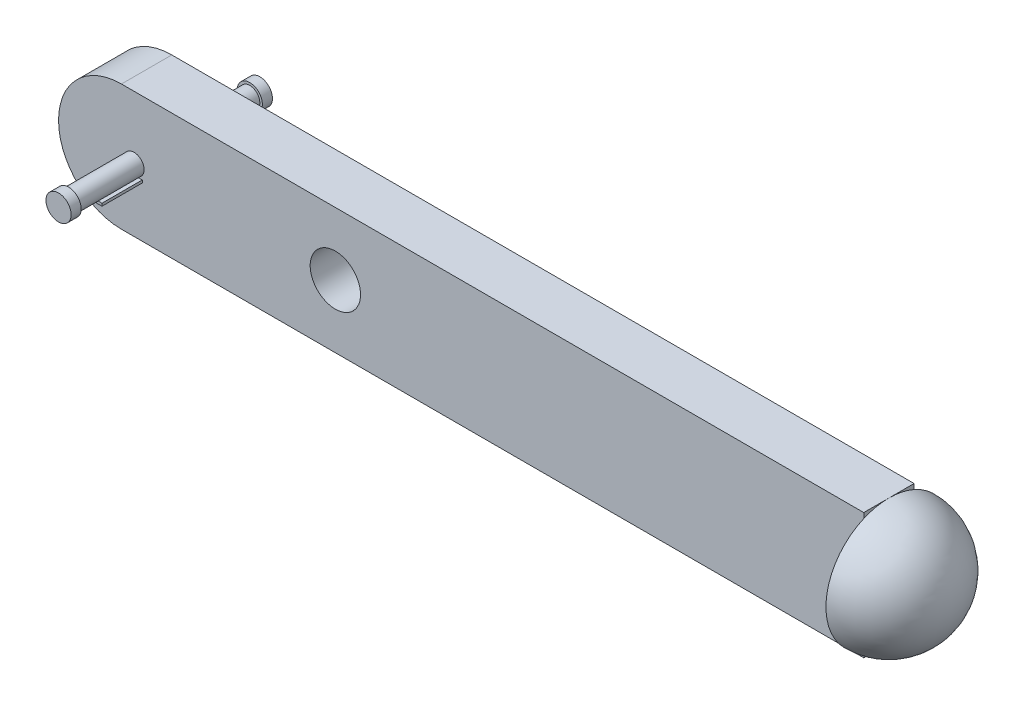
ISO-10303-21;
HEADER;
FILE_DESCRIPTION(('STEP AP214'),'2;1');
FILE_NAME('part.step','',(''),(''),'','','');
FILE_SCHEMA(('AUTOMOTIVE_DESIGN { 1 0 10303 214 1 1 1 1 }'));
ENDSEC;
DATA;
#1=APPLICATION_CONTEXT('core data for automotive mechanical design processes');
#2=APPLICATION_PROTOCOL_DEFINITION('international standard','automotive_design',2000,#1);
#3=PRODUCT_CONTEXT('',#1,'mechanical');
#4=PRODUCT('Part','Part','',(#3));
#5=PRODUCT_RELATED_PRODUCT_CATEGORY('part','',(#4));
#6=PRODUCT_DEFINITION_FORMATION('','',#4);
#7=PRODUCT_DEFINITION_CONTEXT('part definition',#1,'design');
#8=PRODUCT_DEFINITION('design','',#6,#7);
#9=PRODUCT_DEFINITION_SHAPE('','',#8);
#10=(LENGTH_UNIT() NAMED_UNIT(*) SI_UNIT(.MILLI.,.METRE.));
#11=(NAMED_UNIT(*) PLANE_ANGLE_UNIT() SI_UNIT($,.RADIAN.));
#12=(NAMED_UNIT(*) SI_UNIT($,.STERADIAN.) SOLID_ANGLE_UNIT());
#13=UNCERTAINTY_MEASURE_WITH_UNIT(LENGTH_MEASURE(1.E-05),#10,'distance_accuracy_value','');
#14=(GEOMETRIC_REPRESENTATION_CONTEXT(3) GLOBAL_UNCERTAINTY_ASSIGNED_CONTEXT((#13)) GLOBAL_UNIT_ASSIGNED_CONTEXT((#10,
#11,#12)) REPRESENTATION_CONTEXT('',''));
#15=CARTESIAN_POINT('',(0.,0.,0.));
#16=DIRECTION('',(0.,0.,1.));
#17=DIRECTION('',(1.,0.,0.));
#18=AXIS2_PLACEMENT_3D('',#15,#16,#17);
#19=CARTESIAN_POINT('',(-170.812032832531,-25.8599299364117,12.7));
#20=DIRECTION('',(0.,0.,1.));
#21=DIRECTION('',(1.,0.,0.));
#22=AXIS2_PLACEMENT_3D('',#19,#20,#21);
#23=PLANE('',#22);
#24=CARTESIAN_POINT('',(-170.812032832531,-25.8599299364117,12.7));
#25=DIRECTION('',(0.,0.,1.));
#26=DIRECTION('',(1.,0.,0.));
#27=AXIS2_PLACEMENT_3D('',#24,#25,#26);
#28=CIRCLE('',#27,15.875);
#29=CARTESIAN_POINT('',(-170.812032832531,-9.9849299364117,12.7));
#30=VERTEX_POINT('',#29);
#31=CARTESIAN_POINT('',(-170.812032832531,-41.7349299364117,12.7));
#32=VERTEX_POINT('',#31);
#33=EDGE_CURVE('E276',#30,#32,#28,.T.);
#34=ORIENTED_EDGE('',*,*,#33,.T.);
#35=DIRECTION('',(1.,0.,0.));
#36=VECTOR('',#35,1.);
#37=CARTESIAN_POINT('',(-170.812032832531,-41.7349299364117,12.7));
#38=LINE('',#37,#36);
#39=CARTESIAN_POINT('',(16.5129671674695,-41.7349299364117,12.7));
#40=VERTEX_POINT('',#39);
#41=EDGE_CURVE('E279',#32,#40,#38,.T.);
#42=ORIENTED_EDGE('',*,*,#41,.T.);
#43=DIRECTION('',(0.,1.,0.));
#44=VECTOR('',#43,1.);
#45=CARTESIAN_POINT('',(16.5129671674695,-9.9849299364117,12.7));
#46=LINE('',#45,#44);
#47=CARTESIAN_POINT('',(16.5129671674694,-40.4185580614862,12.7));
#48=VERTEX_POINT('',#47);
#49=EDGE_CURVE('E283',#40,#48,#46,.T.);
#50=ORIENTED_EDGE('',*,*,#49,.T.);
#51=DIRECTION('',(0.,-1.,0.));
#52=VECTOR('',#51,1.);
#53=CARTESIAN_POINT('',(16.5129671674695,-25.8599299364121,12.7));
#54=LINE('',#53,#52);
#55=CARTESIAN_POINT('',(16.5129671674694,-11.3013018113372,12.7));
#56=VERTEX_POINT('',#55);
#57=EDGE_CURVE('E252',#56,#48,#54,.T.);
#58=ORIENTED_EDGE('',*,*,#57,.F.);
#59=CARTESIAN_POINT('',(16.5129671674695,-9.9849299364117,12.7));
#60=VERTEX_POINT('',#59);
#61=EDGE_CURVE('E282',#56,#60,#46,.T.);
#62=ORIENTED_EDGE('',*,*,#61,.T.);
#63=DIRECTION('',(-1.,0.,0.));
#64=VECTOR('',#63,1.);
#65=CARTESIAN_POINT('',(-170.812032832531,-9.9849299364117,12.7));
#66=LINE('',#65,#64);
#67=EDGE_CURVE('E286',#60,#30,#66,.T.);
#68=ORIENTED_EDGE('',*,*,#67,.T.);
#69=EDGE_LOOP('',(#34,#42,#50,#58,#62,#68));
#70=FACE_BOUND('',#69,.T.);
#71=CARTESIAN_POINT('',(-116.837032832531,-25.8599299364116,12.7));
#72=DIRECTION('',(0.,0.,1.));
#73=DIRECTION('',(1.,0.,0.));
#74=AXIS2_PLACEMENT_3D('',#71,#72,#73);
#75=CIRCLE('',#74,6.35);
#76=CARTESIAN_POINT('',(-110.487032832531,-25.8599299364116,12.7));
#77=VERTEX_POINT('',#76);
#78=EDGE_CURVE('E270',#77,#77,#75,.T.);
#79=ORIENTED_EDGE('',*,*,#78,.F.);
#80=EDGE_LOOP('',(#79));
#81=FACE_BOUND('',#80,.T.);
#82=DIRECTION('',(0.,-1.,0.));
#83=VECTOR('',#82,1.);
#84=CARTESIAN_POINT('',(-169.626679104184,-28.33418390755,12.7));
#85=LINE('',#84,#83);
#86=CARTESIAN_POINT('',(-169.626679104184,-28.33418390755,12.7));
#87=VERTEX_POINT('',#86);
#88=CARTESIAN_POINT('',(-169.626679104184,-28.9947135871267,12.7));
#89=VERTEX_POINT('',#88);
#90=EDGE_CURVE('E71',#87,#89,#85,.T.);
#91=ORIENTED_EDGE('',*,*,#90,.F.);
#92=DIRECTION('',(-1.,0.,0.));
#93=VECTOR('',#92,1.);
#94=CARTESIAN_POINT('',(-169.626679104184,-28.33418390755,12.7));
#95=LINE('',#94,#93);
#96=CARTESIAN_POINT('',(-168.211199434055,-28.33418390755,12.7));
#97=VERTEX_POINT('',#96);
#98=EDGE_CURVE('E370',#97,#87,#95,.T.);
#99=ORIENTED_EDGE('',*,*,#98,.F.);
#100=CARTESIAN_POINT('',(-167.637032832531,-25.8599299364117,12.7));
#101=DIRECTION('',(0.,0.,1.));
#102=DIRECTION('',(1.,0.,0.));
#103=AXIS2_PLACEMENT_3D('',#100,#101,#102);
#104=CIRCLE('',#103,2.53999999999998);
#105=CARTESIAN_POINT('',(-167.062866231006,-28.33418390755,12.7));
#106=VERTEX_POINT('',#105);
#107=EDGE_CURVE('E259',#97,#106,#104,.F.);
#108=ORIENTED_EDGE('',*,*,#107,.T.);
#109=CARTESIAN_POINT('',(-165.564847217515,-28.33418390755,12.7));
#110=VERTEX_POINT('',#109);
#111=EDGE_CURVE('E181',#110,#106,#95,.T.);
#112=ORIENTED_EDGE('',*,*,#111,.F.);
#113=DIRECTION('',(0.,1.,0.));
#114=VECTOR('',#113,1.);
#115=CARTESIAN_POINT('',(-165.564847217515,-28.33418390755,12.7));
#116=LINE('',#115,#114);
#117=CARTESIAN_POINT('',(-165.564847217515,-28.9947135871267,12.7));
#118=VERTEX_POINT('',#117);
#119=EDGE_CURVE('E367',#118,#110,#116,.T.);
#120=ORIENTED_EDGE('',*,*,#119,.F.);
#121=DIRECTION('',(1.,0.,0.));
#122=VECTOR('',#121,1.);
#123=CARTESIAN_POINT('',(-169.626679104184,-28.9947135871267,12.7));
#124=LINE('',#123,#122);
#125=EDGE_CURVE('E76',#89,#118,#124,.T.);
#126=ORIENTED_EDGE('',*,*,#125,.F.);
#127=EDGE_LOOP('',(#91,#99,#108,#112,#120,#126));
#128=FACE_BOUND('',#127,.T.);
#129=ADVANCED_FACE('F56',(#70,#81,#128),#23,.T.);
#130=CARTESIAN_POINT('',(-167.637032832531,-25.8599299364117,-195.02216631898));
#131=DIRECTION('',(0.,0.,1.));
#132=DIRECTION('',(1.,0.,0.));
#133=AXIS2_PLACEMENT_3D('',#130,#131,#132);
#134=CYLINDRICAL_SURFACE('',#133,2.53999999999998);
#135=CARTESIAN_POINT('',(-167.637032832531,-25.8599299364117,29.21));
#136=DIRECTION('',(0.,0.,1.));
#137=DIRECTION('',(1.,0.,0.));
#138=AXIS2_PLACEMENT_3D('',#135,#136,#137);
#139=CIRCLE('',#138,2.53999999999998);
#140=CARTESIAN_POINT('',(-165.097032832531,-25.8599299364117,29.21));
#141=VERTEX_POINT('',#140);
#142=EDGE_CURVE('E256',#141,#141,#139,.T.);
#143=ORIENTED_EDGE('',*,*,#142,.F.);
#144=EDGE_LOOP('',(#143));
#145=FACE_BOUND('',#144,.T.);
#146=CARTESIAN_POINT('',(-167.637032832531,-25.8599299364117,22.86));
#147=DIRECTION('',(0.,0.,1.));
#148=DIRECTION('',(1.,0.,0.));
#149=AXIS2_PLACEMENT_3D('',#146,#147,#148);
#150=CIRCLE('',#149,2.53999999999998);
#151=CARTESIAN_POINT('',(-167.062866231006,-28.33418390755,22.86));
#152=VERTEX_POINT('',#151);
#153=CARTESIAN_POINT('',(-168.211199434055,-28.33418390755,22.86));
#154=VERTEX_POINT('',#153);
#155=EDGE_CURVE('E350',#152,#154,#150,.F.);
#156=ORIENTED_EDGE('',*,*,#155,.F.);
#157=DIRECTION('',(0.,0.,1.));
#158=VECTOR('',#157,1.);
#159=CARTESIAN_POINT('',(-167.062866231006,-28.33418390755,-195.02216631898));
#160=LINE('',#159,#158);
#161=EDGE_CURVE('E13',#152,#106,#160,.F.);
#162=ORIENTED_EDGE('',*,*,#161,.T.);
#163=ORIENTED_EDGE('',*,*,#107,.F.);
#164=DIRECTION('',(0.,0.,1.));
#165=VECTOR('',#164,1.);
#166=CARTESIAN_POINT('',(-168.211199434055,-28.33418390755,-195.02216631898));
#167=LINE('',#166,#165);
#168=EDGE_CURVE('E64',#97,#154,#167,.T.);
#169=ORIENTED_EDGE('',*,*,#168,.T.);
#170=EDGE_LOOP('',(#156,#162,#163,#169));
#171=FACE_BOUND('',#170,.T.);
#172=ADVANCED_FACE('F355',(#145,#171),#134,.T.);
#173=CARTESIAN_POINT('',(16.5129671674695,-9.9849299364117,12.7));
#174=DIRECTION('',(-1.,0.,0.));
#175=DIRECTION('',(0.,0.,1.));
#176=AXIS2_PLACEMENT_3D('',#173,#174,#175);
#177=PLANE('',#176);
#178=CARTESIAN_POINT('',(16.5129671674694,-25.8599299364117,6.32948599336883));
#179=DIRECTION('',(-1.,0.,0.));
#180=DIRECTION('',(0.,1.,0.));
#181=AXIS2_PLACEMENT_3D('',#178,#179,#180);
#182=CIRCLE('',#181,15.8750132543082);
#183=CARTESIAN_POINT('',(16.5129671674693,-40.4185580614862,0.));
#184=VERTEX_POINT('',#183);
#185=CARTESIAN_POINT('',(16.5129671674694,-41.7349299364117,6.30897198690457));
#186=VERTEX_POINT('',#185);
#187=EDGE_CURVE('E216',#184,#186,#182,.T.);
#188=ORIENTED_EDGE('',*,*,#187,.T.);
#189=DIRECTION('',(0.,0.,-1.));
#190=VECTOR('',#189,1.);
#191=CARTESIAN_POINT('',(16.5129671674695,-41.7349299364117,12.7));
#192=LINE('',#191,#190);
#193=CARTESIAN_POINT('',(16.5129671674695,-41.7349299364117,0.));
#194=VERTEX_POINT('',#193);
#195=EDGE_CURVE('E315',#186,#194,#192,.T.);
#196=ORIENTED_EDGE('',*,*,#195,.T.);
#197=DIRECTION('',(0.,1.,0.));
#198=VECTOR('',#197,1.);
#199=CARTESIAN_POINT('',(16.5129671674695,-9.9849299364117,0.));
#200=LINE('',#199,#198);
#201=EDGE_CURVE('E295',#194,#184,#200,.T.);
#202=ORIENTED_EDGE('',*,*,#201,.T.);
#203=EDGE_LOOP('',(#188,#196,#202));
#204=FACE_BOUND('',#203,.T.);
#205=ADVANCED_FACE('F385',(#204),#177,.F.);
#206=CARTESIAN_POINT('',(16.5129671674695,-9.9849299364117,6.30897198690457));
#207=VERTEX_POINT('',#206);
#208=CARTESIAN_POINT('',(16.5129671674693,-11.3013018113372,0.));
#209=VERTEX_POINT('',#208);
#210=EDGE_CURVE('E439',#207,#209,#182,.T.);
#211=ORIENTED_EDGE('',*,*,#210,.T.);
#212=CARTESIAN_POINT('',(16.5129671674695,-9.9849299364117,0.));
#213=VERTEX_POINT('',#212);
#214=EDGE_CURVE('E294',#209,#213,#200,.T.);
#215=ORIENTED_EDGE('',*,*,#214,.T.);
#216=DIRECTION('',(0.,0.,-1.));
#217=VECTOR('',#216,1.);
#218=CARTESIAN_POINT('',(16.5129671674695,-9.9849299364117,12.7));
#219=LINE('',#218,#217);
#220=EDGE_CURVE('E301',#207,#213,#219,.T.);
#221=ORIENTED_EDGE('',*,*,#220,.F.);
#222=EDGE_LOOP('',(#211,#215,#221));
#223=FACE_BOUND('',#222,.T.);
#224=ADVANCED_FACE('F453',(#223),#177,.F.);
#225=CARTESIAN_POINT('',(16.5129671674694,-25.8599299364117,6.37051400663117));
#226=DIRECTION('',(1.,0.,0.));
#227=DIRECTION('',(0.,1.,0.));
#228=AXIS2_PLACEMENT_3D('',#225,#226,#227);
#229=CIRCLE('',#228,15.8750132543082);
#230=CARTESIAN_POINT('',(16.5129671674695,-9.9849299364117,6.39102801309543));
#231=VERTEX_POINT('',#230);
#232=EDGE_CURVE('E195',#231,#56,#229,.T.);
#233=ORIENTED_EDGE('',*,*,#232,.F.);
#234=EDGE_CURVE('E311',#60,#231,#219,.T.);
#235=ORIENTED_EDGE('',*,*,#234,.F.);
#236=ORIENTED_EDGE('',*,*,#61,.F.);
#237=EDGE_LOOP('',(#233,#235,#236));
#238=FACE_BOUND('',#237,.T.);
#239=ADVANCED_FACE('F395',(#238),#177,.F.);
#240=CARTESIAN_POINT('',(-170.812032832531,-25.8599299364117,0.));
#241=DIRECTION('',(0.,0.,1.));
#242=DIRECTION('',(1.,0.,0.));
#243=AXIS2_PLACEMENT_3D('',#240,#241,#242);
#244=PLANE('',#243);
#245=CARTESIAN_POINT('',(-170.812032832531,-25.8599299364117,0.));
#246=DIRECTION('',(0.,0.,1.));
#247=DIRECTION('',(1.,0.,0.));
#248=AXIS2_PLACEMENT_3D('',#245,#246,#247);
#249=CIRCLE('',#248,15.875);
#250=CARTESIAN_POINT('',(-170.812032832531,-9.9849299364117,0.));
#251=VERTEX_POINT('',#250);
#252=CARTESIAN_POINT('',(-170.812032832531,-41.7349299364117,0.));
#253=VERTEX_POINT('',#252);
#254=EDGE_CURVE('E273',#251,#253,#249,.T.);
#255=ORIENTED_EDGE('',*,*,#254,.F.);
#256=DIRECTION('',(-1.,0.,0.));
#257=VECTOR('',#256,1.);
#258=CARTESIAN_POINT('',(-170.812032832531,-9.9849299364117,0.));
#259=LINE('',#258,#257);
#260=EDGE_CURVE('E280',#213,#251,#259,.T.);
#261=ORIENTED_EDGE('',*,*,#260,.F.);
#262=ORIENTED_EDGE('',*,*,#214,.F.);
#263=DIRECTION('',(0.,-1.,0.));
#264=VECTOR('',#263,1.);
#265=CARTESIAN_POINT('',(16.5129671674693,-25.8599299364121,0.));
#266=LINE('',#265,#264);
#267=EDGE_CURVE('E447',#209,#184,#266,.T.);
#268=ORIENTED_EDGE('',*,*,#267,.T.);
#269=ORIENTED_EDGE('',*,*,#201,.F.);
#270=DIRECTION('',(1.,0.,0.));
#271=VECTOR('',#270,1.);
#272=CARTESIAN_POINT('',(-170.812032832531,-41.7349299364117,0.));
#273=LINE('',#272,#271);
#274=EDGE_CURVE('E291',#253,#194,#273,.T.);
#275=ORIENTED_EDGE('',*,*,#274,.F.);
#276=EDGE_LOOP('',(#255,#261,#262,#268,#269,#275));
#277=FACE_BOUND('',#276,.T.);
#278=CARTESIAN_POINT('',(-116.837032832531,-25.8599299364116,0.));
#279=DIRECTION('',(0.,0.,1.));
#280=DIRECTION('',(1.,0.,0.));
#281=AXIS2_PLACEMENT_3D('',#278,#279,#280);
#282=CIRCLE('',#281,6.35);
#283=CARTESIAN_POINT('',(-110.487032832531,-25.8599299364116,0.));
#284=VERTEX_POINT('',#283);
#285=EDGE_CURVE('E269',#284,#284,#282,.T.);
#286=ORIENTED_EDGE('',*,*,#285,.T.);
#287=EDGE_LOOP('',(#286));
#288=FACE_BOUND('',#287,.T.);
#289=CARTESIAN_POINT('',(-167.637032832531,-25.8599299364117,0.));
#290=DIRECTION('',(0.,0.,1.));
#291=DIRECTION('',(1.,0.,0.));
#292=AXIS2_PLACEMENT_3D('',#289,#290,#291);
#293=CIRCLE('',#292,2.53999999999998);
#294=CARTESIAN_POINT('',(-165.097032832531,-25.8599299364117,0.));
#295=VERTEX_POINT('',#294);
#296=EDGE_CURVE('E251',#295,#295,#293,.F.);
#297=ORIENTED_EDGE('',*,*,#296,.F.);
#298=EDGE_LOOP('',(#297));
#299=FACE_BOUND('',#298,.T.);
#300=ADVANCED_FACE('F393',(#277,#288,#299),#244,.F.);
#301=CARTESIAN_POINT('',(-170.812032832531,-25.8599299364117,12.7));
#302=DIRECTION('',(0.,0.,-1.));
#303=DIRECTION('',(-1.,0.,0.));
#304=AXIS2_PLACEMENT_3D('',#301,#302,#303);
#305=CYLINDRICAL_SURFACE('',#304,15.875);
#306=ORIENTED_EDGE('',*,*,#254,.T.);
#307=DIRECTION('',(0.,0.,-1.));
#308=VECTOR('',#307,1.);
#309=CARTESIAN_POINT('',(-170.812032832531,-41.7349299364117,12.7));
#310=LINE('',#309,#308);
#311=EDGE_CURVE('E351',#32,#253,#310,.T.);
#312=ORIENTED_EDGE('',*,*,#311,.F.);
#313=ORIENTED_EDGE('',*,*,#33,.F.);
#314=DIRECTION('',(0.,0.,-1.));
#315=VECTOR('',#314,1.);
#316=CARTESIAN_POINT('',(-170.812032832531,-9.9849299364117,12.7));
#317=LINE('',#316,#315);
#318=EDGE_CURVE('E288',#30,#251,#317,.T.);
#319=ORIENTED_EDGE('',*,*,#318,.T.);
#320=EDGE_LOOP('',(#306,#312,#313,#319));
#321=FACE_BOUND('',#320,.T.);
#322=ADVANCED_FACE('F58',(#321),#305,.T.);
#323=CARTESIAN_POINT('',(-170.812032832531,-41.7349299364117,12.7));
#324=DIRECTION('',(0.,1.,0.));
#325=DIRECTION('',(0.,0.,1.));
#326=AXIS2_PLACEMENT_3D('',#323,#324,#325);
#327=PLANE('',#326);
#328=ORIENTED_EDGE('',*,*,#274,.T.);
#329=ORIENTED_EDGE('',*,*,#195,.F.);
#330=CARTESIAN_POINT('',(16.5129671674695,-41.7349299364117,6.30897198690457));
#331=DIRECTION('',(0.,0.,1.));
#332=VECTOR('',#331,1.);
#333=LINE('',#330,#332);
#334=CARTESIAN_POINT('',(16.5129671674694,-41.7349299364113,6.35));
#335=VERTEX_POINT('',#334);
#336=EDGE_CURVE('E434',#186,#335,#333,.T.);
#337=ORIENTED_EDGE('',*,*,#336,.T.);
#338=CARTESIAN_POINT('',(16.5129671674694,-41.7349299364117,6.39102801309543));
#339=CARTESIAN_POINT('',(16.5129671674694,-41.7349321454628,6.38931851350131));
#340=CARTESIAN_POINT('',(16.5129671674694,-41.7349340783826,6.38760901355037));
#341=CARTESIAN_POINT('',(16.5129671674694,-41.7349373919596,6.38419001311326));
#342=CARTESIAN_POINT('',(16.5129671674694,-41.7349387726168,6.38248051262709));
#343=CARTESIAN_POINT('',(16.5129671674694,-41.7349409816683,6.37906151129792));
#344=CARTESIAN_POINT('',(16.5129671674694,-41.7349418100627,6.37735201045493));
#345=CARTESIAN_POINT('',(16.5129671674694,-41.7349429145885,6.37393300859053));
#346=CARTESIAN_POINT('',(16.5129671674694,-41.7349431907199,6.37222350756912));
#347=CARTESIAN_POINT('',(16.5129671674694,-41.7349431907199,6.36880450552631));
#348=CARTESIAN_POINT('',(16.5129671674694,-41.7349429145884,6.3670950045049));
#349=CARTESIAN_POINT('',(16.5129671674694,-41.7349418100626,6.3636760026405));
#350=CARTESIAN_POINT('',(16.5129671674694,-41.7349409816682,6.3619665017975));
#351=CARTESIAN_POINT('',(16.5129671674694,-41.7349387726167,6.35854750046834));
#352=CARTESIAN_POINT('',(16.5129671674694,-41.7349373919595,6.35683799998217));
#353=CARTESIAN_POINT('',(16.5129671674694,-41.7349340783824,6.35341899954506));
#354=CARTESIAN_POINT('',(16.5129671674694,-41.7349321454626,6.35170949959412));
#355=CARTESIAN_POINT('',(16.5129671674694,-41.7349299364115,6.35));
#356=B_SPLINE_CURVE_WITH_KNOTS('',3,(#338,#339,#340,#341,#342,#343,#344,#345,#346,#347,#348,
#349,#350,#351,#352,#353,#354,#355),.UNSPECIFIED.,.F.,.F.,(4,2,2,2,2,2,2,2,4),(0.,
0.00512850304191755,0.0102570060838343,0.0153855091257516,0.0205140121676691,0.0256425152095866,
0.0307710182515039,0.0358995212934216,0.0410280243353383),.UNSPECIFIED.);
#357=CARTESIAN_POINT('',(16.5129671674694,-41.7349299364117,6.39102801309543));
#358=VERTEX_POINT('',#357);
#359=EDGE_CURVE('E211',#358,#335,#356,.T.);
#360=ORIENTED_EDGE('',*,*,#359,.F.);
#361=EDGE_CURVE('E327',#40,#358,#192,.T.);
#362=ORIENTED_EDGE('',*,*,#361,.F.);
#363=ORIENTED_EDGE('',*,*,#41,.F.);
#364=ORIENTED_EDGE('',*,*,#311,.T.);
#365=EDGE_LOOP('',(#328,#329,#337,#360,#362,#363,#364));
#366=FACE_BOUND('',#365,.T.);
#367=ADVANCED_FACE('F329',(#366),#327,.F.);
#368=EDGE_CURVE('E184',#48,#358,#229,.T.);
#369=ORIENTED_EDGE('',*,*,#368,.F.);
#370=ORIENTED_EDGE('',*,*,#49,.F.);
#371=ORIENTED_EDGE('',*,*,#361,.T.);
#372=EDGE_LOOP('',(#369,#370,#371));
#373=FACE_BOUND('',#372,.T.);
#374=ADVANCED_FACE('F338',(#373),#177,.F.);
#375=CARTESIAN_POINT('',(-170.812032832531,-9.9849299364117,12.7));
#376=DIRECTION('',(0.,-1.,0.));
#377=DIRECTION('',(0.,0.,-1.));
#378=AXIS2_PLACEMENT_3D('',#375,#376,#377);
#379=PLANE('',#378);
#380=ORIENTED_EDGE('',*,*,#260,.T.);
#381=ORIENTED_EDGE('',*,*,#318,.F.);
#382=ORIENTED_EDGE('',*,*,#67,.F.);
#383=ORIENTED_EDGE('',*,*,#234,.T.);
#384=CARTESIAN_POINT('',(16.5129671674695,-9.9849299364117,6.39102801309543));
#385=DIRECTION('',(0.,0.,-1.));
#386=VECTOR('',#385,1.);
#387=LINE('',#384,#386);
#388=CARTESIAN_POINT('',(16.5129671674694,-9.9849299364117,6.35));
#389=VERTEX_POINT('',#388);
#390=EDGE_CURVE('E316',#231,#389,#387,.T.);
#391=ORIENTED_EDGE('',*,*,#390,.T.);
#392=CARTESIAN_POINT('',(16.5129671674695,-9.9849299364117,6.35000000016691));
#393=DIRECTION('',(0.,0.,-1.));
#394=VECTOR('',#393,1.);
#395=LINE('',#392,#394);
#396=EDGE_CURVE('E414',#389,#207,#395,.T.);
#397=ORIENTED_EDGE('',*,*,#396,.T.);
#398=ORIENTED_EDGE('',*,*,#220,.T.);
#399=EDGE_LOOP('',(#380,#381,#382,#383,#391,#397,#398));
#400=FACE_BOUND('',#399,.T.);
#401=ADVANCED_FACE('F397',(#400),#379,.F.);
#402=CARTESIAN_POINT('',(-116.837032832531,-25.8599299364116,12.7));
#403=DIRECTION('',(0.,0.,-1.));
#404=DIRECTION('',(-1.,0.,0.));
#405=AXIS2_PLACEMENT_3D('',#402,#403,#404);
#406=CYLINDRICAL_SURFACE('',#405,6.35);
#407=ORIENTED_EDGE('',*,*,#78,.T.);
#408=EDGE_LOOP('',(#407));
#409=FACE_BOUND('',#408,.T.);
#410=ORIENTED_EDGE('',*,*,#285,.F.);
#411=EDGE_LOOP('',(#410));
#412=FACE_BOUND('',#411,.T.);
#413=ADVANCED_FACE('F391',(#409,#412),#406,.F.);
#414=CARTESIAN_POINT('',(-85.0870328325305,-25.8599299364117,29.21));
#415=DIRECTION('',(0.,0.,1.));
#416=DIRECTION('',(1.,0.,0.));
#417=AXIS2_PLACEMENT_3D('',#414,#415,#416);
#418=PLANE('',#417);
#419=CARTESIAN_POINT('',(-167.637032832531,-25.8599299364117,29.21));
#420=DIRECTION('',(0.,0.,1.));
#421=DIRECTION('',(1.,0.,0.));
#422=AXIS2_PLACEMENT_3D('',#419,#420,#421);
#423=CIRCLE('',#422,3.175);
#424=CARTESIAN_POINT('',(-164.46203283253,-25.8599299364117,29.21));
#425=VERTEX_POINT('',#424);
#426=EDGE_CURVE('E262',#425,#425,#423,.F.);
#427=ORIENTED_EDGE('',*,*,#426,.T.);
#428=EDGE_LOOP('',(#427));
#429=FACE_BOUND('',#428,.T.);
#430=ORIENTED_EDGE('',*,*,#142,.T.);
#431=EDGE_LOOP('',(#430));
#432=FACE_BOUND('',#431,.T.);
#433=ADVANCED_FACE('F612',(#429,#432),#418,.F.);
#434=CARTESIAN_POINT('',(-167.637032832531,-25.8599299364117,31.75));
#435=DIRECTION('',(0.,0.,1.));
#436=DIRECTION('',(1.,0.,0.));
#437=AXIS2_PLACEMENT_3D('',#434,#435,#436);
#438=PLANE('',#437);
#439=CARTESIAN_POINT('',(-167.637032832531,-25.8599299364117,31.75));
#440=DIRECTION('',(0.,0.,1.));
#441=DIRECTION('',(1.,0.,0.));
#442=AXIS2_PLACEMENT_3D('',#439,#440,#441);
#443=CIRCLE('',#442,3.175);
#444=CARTESIAN_POINT('',(-164.46203283253,-25.8599299364117,31.75));
#445=VERTEX_POINT('',#444);
#446=EDGE_CURVE('E263',#445,#445,#443,.T.);
#447=ORIENTED_EDGE('',*,*,#446,.T.);
#448=EDGE_LOOP('',(#447));
#449=FACE_BOUND('',#448,.T.);
#450=ADVANCED_FACE('F605',(#449),#438,.T.);
#451=CARTESIAN_POINT('',(-167.637032832531,-25.8599299364117,-19.05));
#452=DIRECTION('',(0.,0.,1.));
#453=DIRECTION('',(1.,0.,0.));
#454=AXIS2_PLACEMENT_3D('',#451,#452,#453);
#455=CYLINDRICAL_SURFACE('',#454,3.175);
#456=ORIENTED_EDGE('',*,*,#426,.F.);
#457=EDGE_LOOP('',(#456));
#458=FACE_BOUND('',#457,.T.);
#459=ORIENTED_EDGE('',*,*,#446,.F.);
#460=EDGE_LOOP('',(#459));
#461=FACE_BOUND('',#460,.T.);
#462=ADVANCED_FACE('F462',(#458,#461),#455,.T.);
#463=CARTESIAN_POINT('',(-167.637032832531,-25.8599299364117,207.72216631898));
#464=DIRECTION('',(0.,0.,-1.));
#465=DIRECTION('',(-1.,0.,0.));
#466=AXIS2_PLACEMENT_3D('',#463,#464,#465);
#467=CYLINDRICAL_SURFACE('',#466,2.53999999999998);
#468=CARTESIAN_POINT('',(-167.637032832531,-25.8599299364117,-16.51));
#469=DIRECTION('',(0.,0.,-1.));
#470=DIRECTION('',(-1.,0.,0.));
#471=AXIS2_PLACEMENT_3D('',#468,#469,#470);
#472=CIRCLE('',#471,2.53999999999998);
#473=CARTESIAN_POINT('',(-170.177032832531,-25.8599299364117,-16.51));
#474=VERTEX_POINT('',#473);
#475=EDGE_CURVE('E243',#474,#474,#472,.T.);
#476=ORIENTED_EDGE('',*,*,#475,.F.);
#477=EDGE_LOOP('',(#476));
#478=FACE_BOUND('',#477,.T.);
#479=ORIENTED_EDGE('',*,*,#296,.T.);
#480=EDGE_LOOP('',(#479));
#481=FACE_BOUND('',#480,.T.);
#482=ADVANCED_FACE('F590',(#478,#481),#467,.T.);
#483=CARTESIAN_POINT('',(-85.0870328325305,-25.8599299364117,-16.51));
#484=DIRECTION('',(0.,0.,-1.));
#485=DIRECTION('',(-1.,0.,0.));
#486=AXIS2_PLACEMENT_3D('',#483,#484,#485);
#487=PLANE('',#486);
#488=CARTESIAN_POINT('',(-167.637032832531,-25.8599299364117,-16.51));
#489=DIRECTION('',(0.,0.,-1.));
#490=DIRECTION('',(-1.,0.,0.));
#491=AXIS2_PLACEMENT_3D('',#488,#489,#490);
#492=CIRCLE('',#491,3.175);
#493=CARTESIAN_POINT('',(-170.812032832531,-25.8599299364117,-16.51));
#494=VERTEX_POINT('',#493);
#495=EDGE_CURVE('E255',#494,#494,#492,.F.);
#496=ORIENTED_EDGE('',*,*,#495,.T.);
#497=EDGE_LOOP('',(#496));
#498=FACE_BOUND('',#497,.T.);
#499=ORIENTED_EDGE('',*,*,#475,.T.);
#500=EDGE_LOOP('',(#499));
#501=FACE_BOUND('',#500,.T.);
#502=ADVANCED_FACE('F231',(#498,#501),#487,.F.);
#503=CARTESIAN_POINT('',(-167.637032832531,-25.8599299364117,-19.05));
#504=DIRECTION('',(0.,0.,1.));
#505=DIRECTION('',(1.,0.,0.));
#506=AXIS2_PLACEMENT_3D('',#503,#504,#505);
#507=PLANE('',#506);
#508=CARTESIAN_POINT('',(-167.637032832531,-25.8599299364117,-19.05));
#509=DIRECTION('',(0.,0.,1.));
#510=DIRECTION('',(1.,0.,0.));
#511=AXIS2_PLACEMENT_3D('',#508,#509,#510);
#512=CIRCLE('',#511,3.175);
#513=CARTESIAN_POINT('',(-164.46203283253,-25.8599299364117,-19.05));
#514=VERTEX_POINT('',#513);
#515=EDGE_CURVE('E266',#514,#514,#512,.T.);
#516=ORIENTED_EDGE('',*,*,#515,.F.);
#517=EDGE_LOOP('',(#516));
#518=FACE_BOUND('',#517,.T.);
#519=ADVANCED_FACE('F460',(#518),#507,.F.);
#520=ORIENTED_EDGE('',*,*,#495,.F.);
#521=EDGE_LOOP('',(#520));
#522=FACE_BOUND('',#521,.T.);
#523=ORIENTED_EDGE('',*,*,#515,.T.);
#524=EDGE_LOOP('',(#523));
#525=FACE_BOUND('',#524,.T.);
#526=ADVANCED_FACE('F456',(#522,#525),#455,.T.);
#527=CARTESIAN_POINT('',(16.5129671674694,-25.8599299364117,6.32948599336883));
#528=DIRECTION('',(-1.,0.,0.));
#529=DIRECTION('',(0.,1.,0.));
#530=AXIS2_PLACEMENT_3D('',#527,#528,#529);
#531=PLANE('',#530);
#532=ORIENTED_EDGE('',*,*,#267,.F.);
#533=EDGE_CURVE('E196',#209,#184,#182,.T.);
#534=ORIENTED_EDGE('',*,*,#533,.T.);
#535=EDGE_LOOP('',(#532,#534));
#536=FACE_BOUND('',#535,.T.);
#537=ADVANCED_FACE('F229',(#536),#531,.T.);
#538=CARTESIAN_POINT('',(16.5334811741006,-25.8599299364117,6.35));
#539=DIRECTION('',(0.,0.,-1.));
#540=DIRECTION('',(1.,0.,0.));
#541=AXIS2_PLACEMENT_3D('',#538,#539,#540);
#542=CIRCLE('',#541,15.8750132543082);
#543=TRIMMED_CURVE('',#542,(PARAMETER_VALUE(-1.57208854696578)),
(PARAMETER_VALUE(1.57208854696578)),.T.,.PARAMETER.);
#544=CARTESIAN_POINT('',(16.5129671674694,-25.8599299364117,6.35));
#545=DIRECTION('',(0.,-1.,0.));
#546=AXIS1_PLACEMENT('',#544,#545);
#547=SURFACE_OF_REVOLUTION('',#543,#546);
#548=ORIENTED_EDGE('',*,*,#390,.F.);
#549=ORIENTED_EDGE('',*,*,#232,.T.);
#550=EDGE_CURVE('E186',#56,#48,#229,.T.);
#551=ORIENTED_EDGE('',*,*,#550,.T.);
#552=ORIENTED_EDGE('',*,*,#368,.T.);
#553=ORIENTED_EDGE('',*,*,#359,.T.);
#554=ORIENTED_EDGE('',*,*,#336,.F.);
#555=ORIENTED_EDGE('',*,*,#187,.F.);
#556=ORIENTED_EDGE('',*,*,#533,.F.);
#557=ORIENTED_EDGE('',*,*,#210,.F.);
#558=ORIENTED_EDGE('',*,*,#396,.F.);
#559=EDGE_LOOP('',(#548,#549,#551,#552,#553,#554,#555,#556,#557,#558));
#560=FACE_BOUND('',#559,.T.);
#561=ADVANCED_FACE('F218',(#560),#547,.T.);
#562=ORIENTED_EDGE('',*,*,#550,.F.);
#563=ORIENTED_EDGE('',*,*,#57,.T.);
#564=EDGE_LOOP('',(#562,#563));
#565=FACE_BOUND('',#564,.T.);
#566=ADVANCED_FACE('F228',(#565),#531,.T.);
#567=CARTESIAN_POINT('',(-169.626679104184,-28.33418390755,22.86));
#568=DIRECTION('',(0.,-1.,0.));
#569=DIRECTION('',(0.,0.,-1.));
#570=AXIS2_PLACEMENT_3D('',#567,#568,#569);
#571=PLANE('',#570);
#572=ORIENTED_EDGE('',*,*,#161,.F.);
#573=DIRECTION('',(-1.,0.,0.));
#574=VECTOR('',#573,1.);
#575=CARTESIAN_POINT('',(-169.626679104184,-28.33418390755,22.86));
#576=LINE('',#575,#574);
#577=CARTESIAN_POINT('',(-165.564847217515,-28.33418390755,22.86));
#578=VERTEX_POINT('',#577);
#579=EDGE_CURVE('E359',#578,#152,#576,.T.);
#580=ORIENTED_EDGE('',*,*,#579,.F.);
#581=DIRECTION('',(0.,0.,-1.));
#582=VECTOR('',#581,1.);
#583=CARTESIAN_POINT('',(-165.564847217515,-28.33418390755,22.86));
#584=LINE('',#583,#582);
#585=EDGE_CURVE('E188',#578,#110,#584,.T.);
#586=ORIENTED_EDGE('',*,*,#585,.T.);
#587=ORIENTED_EDGE('',*,*,#111,.T.);
#588=EDGE_LOOP('',(#572,#580,#586,#587));
#589=FACE_BOUND('',#588,.T.);
#590=ADVANCED_FACE('F376',(#589),#571,.F.);
#591=CARTESIAN_POINT('',(-169.626679104184,-28.33418390755,22.86));
#592=DIRECTION('',(1.,0.,0.));
#593=DIRECTION('',(0.,0.,-1.));
#594=AXIS2_PLACEMENT_3D('',#591,#592,#593);
#595=PLANE('',#594);
#596=ORIENTED_EDGE('',*,*,#90,.T.);
#597=DIRECTION('',(0.,0.,-1.));
#598=VECTOR('',#597,1.);
#599=CARTESIAN_POINT('',(-169.626679104184,-28.9947135871267,22.86));
#600=LINE('',#599,#598);
#601=CARTESIAN_POINT('',(-169.626679104184,-28.9947135871267,22.86));
#602=VERTEX_POINT('',#601);
#603=EDGE_CURVE('E164',#602,#89,#600,.T.);
#604=ORIENTED_EDGE('',*,*,#603,.F.);
#605=DIRECTION('',(0.,-1.,0.));
#606=VECTOR('',#605,1.);
#607=CARTESIAN_POINT('',(-169.626679104184,-28.33418390755,22.86));
#608=LINE('',#607,#606);
#609=CARTESIAN_POINT('',(-169.626679104184,-28.33418390755,22.86));
#610=VERTEX_POINT('',#609);
#611=EDGE_CURVE('E170',#610,#602,#608,.T.);
#612=ORIENTED_EDGE('',*,*,#611,.F.);
#613=DIRECTION('',(0.,0.,-1.));
#614=VECTOR('',#613,1.);
#615=CARTESIAN_POINT('',(-169.626679104184,-28.33418390755,22.86));
#616=LINE('',#615,#614);
#617=EDGE_CURVE('E361',#610,#87,#616,.T.);
#618=ORIENTED_EDGE('',*,*,#617,.T.);
#619=EDGE_LOOP('',(#596,#604,#612,#618));
#620=FACE_BOUND('',#619,.T.);
#621=ADVANCED_FACE('F183',(#620),#595,.F.);
#622=CARTESIAN_POINT('',(-169.626679104184,-28.9947135871267,22.86));
#623=DIRECTION('',(0.,1.,0.));
#624=DIRECTION('',(0.,0.,1.));
#625=AXIS2_PLACEMENT_3D('',#622,#623,#624);
#626=PLANE('',#625);
#627=ORIENTED_EDGE('',*,*,#125,.T.);
#628=DIRECTION('',(0.,0.,-1.));
#629=VECTOR('',#628,1.);
#630=CARTESIAN_POINT('',(-165.564847217515,-28.9947135871267,22.86));
#631=LINE('',#630,#629);
#632=CARTESIAN_POINT('',(-165.564847217515,-28.9947135871267,22.86));
#633=VERTEX_POINT('',#632);
#634=EDGE_CURVE('E166',#633,#118,#631,.T.);
#635=ORIENTED_EDGE('',*,*,#634,.F.);
#636=DIRECTION('',(1.,0.,0.));
#637=VECTOR('',#636,1.);
#638=CARTESIAN_POINT('',(-169.626679104184,-28.9947135871267,22.86));
#639=LINE('',#638,#637);
#640=EDGE_CURVE('E160',#602,#633,#639,.T.);
#641=ORIENTED_EDGE('',*,*,#640,.F.);
#642=ORIENTED_EDGE('',*,*,#603,.T.);
#643=EDGE_LOOP('',(#627,#635,#641,#642));
#644=FACE_BOUND('',#643,.T.);
#645=ADVANCED_FACE('F162',(#644),#626,.F.);
#646=CARTESIAN_POINT('',(-165.564847217515,-28.33418390755,22.86));
#647=DIRECTION('',(-1.,0.,0.));
#648=DIRECTION('',(0.,0.,1.));
#649=AXIS2_PLACEMENT_3D('',#646,#647,#648);
#650=PLANE('',#649);
#651=ORIENTED_EDGE('',*,*,#119,.T.);
#652=ORIENTED_EDGE('',*,*,#585,.F.);
#653=DIRECTION('',(0.,1.,0.));
#654=VECTOR('',#653,1.);
#655=CARTESIAN_POINT('',(-165.564847217515,-28.33418390755,22.86));
#656=LINE('',#655,#654);
#657=EDGE_CURVE('E169',#633,#578,#656,.T.);
#658=ORIENTED_EDGE('',*,*,#657,.F.);
#659=ORIENTED_EDGE('',*,*,#634,.T.);
#660=EDGE_LOOP('',(#651,#652,#658,#659));
#661=FACE_BOUND('',#660,.T.);
#662=ADVANCED_FACE('F378',(#661),#650,.F.);
#663=ORIENTED_EDGE('',*,*,#168,.F.);
#664=ORIENTED_EDGE('',*,*,#98,.T.);
#665=ORIENTED_EDGE('',*,*,#617,.F.);
#666=EDGE_CURVE('E177',#154,#610,#576,.T.);
#667=ORIENTED_EDGE('',*,*,#666,.F.);
#668=EDGE_LOOP('',(#663,#664,#665,#667));
#669=FACE_BOUND('',#668,.T.);
#670=ADVANCED_FACE('F360',(#669),#571,.F.);
#671=CARTESIAN_POINT('',(0.,0.,22.86));
#672=DIRECTION('',(0.,0.,1.));
#673=DIRECTION('',(1.,0.,0.));
#674=AXIS2_PLACEMENT_3D('',#671,#672,#673);
#675=PLANE('',#674);
#676=ORIENTED_EDGE('',*,*,#579,.T.);
#677=ORIENTED_EDGE('',*,*,#155,.T.);
#678=ORIENTED_EDGE('',*,*,#666,.T.);
#679=ORIENTED_EDGE('',*,*,#611,.T.);
#680=ORIENTED_EDGE('',*,*,#640,.T.);
#681=ORIENTED_EDGE('',*,*,#657,.T.);
#682=EDGE_LOOP('',(#676,#677,#678,#679,#680,#681));
#683=FACE_BOUND('',#682,.T.);
#684=ADVANCED_FACE('F174',(#683),#675,.T.);
#685=CLOSED_SHELL('',(#129,#172,#205,#224,#239,#300,#322,#367,#374,#401,#413,#433,#450,#462,
#482,#502,#519,#526,#537,#561,#566,#590,#621,#645,#662,#670,#684));
#686=MANIFOLD_SOLID_BREP('B2',#685);
#687=ADVANCED_BREP_SHAPE_REPRESENTATION('',(#18,#686),#14);
#688=SHAPE_DEFINITION_REPRESENTATION(#9,#687);
ENDSEC;
END-ISO-10303-21;
